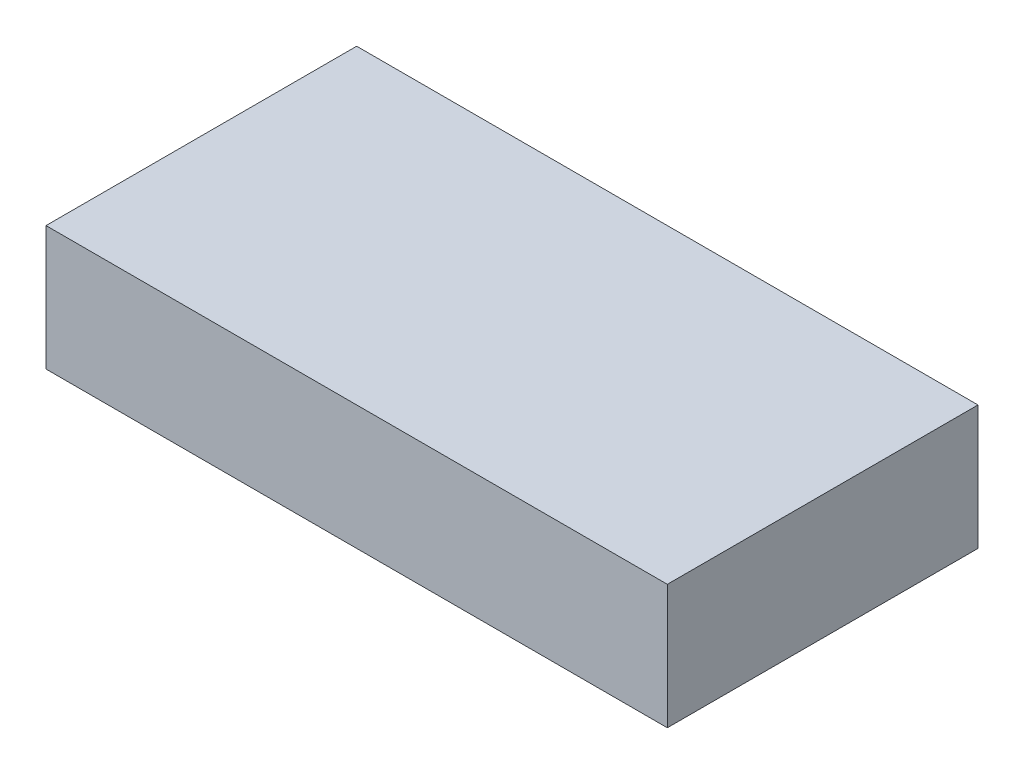
ISO-10303-21;
HEADER;
FILE_DESCRIPTION(('STEP AP214'),'2;1');
FILE_NAME('part.step','',(''),(''),'','','');
FILE_SCHEMA(('AUTOMOTIVE_DESIGN { 1 0 10303 214 1 1 1 1 }'));
ENDSEC;
DATA;
#1=APPLICATION_CONTEXT('core data for automotive mechanical design processes');
#2=APPLICATION_PROTOCOL_DEFINITION('international standard','automotive_design',2000,#1);
#3=PRODUCT_CONTEXT('',#1,'mechanical');
#4=PRODUCT('Part','Part','',(#3));
#5=PRODUCT_RELATED_PRODUCT_CATEGORY('part','',(#4));
#6=PRODUCT_DEFINITION_FORMATION('','',#4);
#7=PRODUCT_DEFINITION_CONTEXT('part definition',#1,'design');
#8=PRODUCT_DEFINITION('design','',#6,#7);
#9=PRODUCT_DEFINITION_SHAPE('','',#8);
#10=(LENGTH_UNIT() NAMED_UNIT(*) SI_UNIT(.MILLI.,.METRE.));
#11=(NAMED_UNIT(*) PLANE_ANGLE_UNIT() SI_UNIT($,.RADIAN.));
#12=(NAMED_UNIT(*) SI_UNIT($,.STERADIAN.) SOLID_ANGLE_UNIT());
#13=UNCERTAINTY_MEASURE_WITH_UNIT(LENGTH_MEASURE(1.E-05),#10,'distance_accuracy_value','');
#14=(GEOMETRIC_REPRESENTATION_CONTEXT(3) GLOBAL_UNCERTAINTY_ASSIGNED_CONTEXT((#13)) GLOBAL_UNIT_ASSIGNED_CONTEXT((#10,
#11,#12)) REPRESENTATION_CONTEXT('',''));
#15=CARTESIAN_POINT('',(0.,0.,0.));
#16=DIRECTION('',(0.,0.,1.));
#17=DIRECTION('',(1.,0.,0.));
#18=AXIS2_PLACEMENT_3D('',#15,#16,#17);
#19=CARTESIAN_POINT('',(0.,0.,0.));
#20=DIRECTION('',(0.,-1.,0.));
#21=DIRECTION('',(0.,0.,-1.));
#22=AXIS2_PLACEMENT_3D('',#19,#20,#21);
#23=PLANE('',#22);
#24=DIRECTION('',(0.,0.,1.));
#25=VECTOR('',#24,1.);
#26=CARTESIAN_POINT('',(0.,0.,0.));
#27=LINE('',#26,#25);
#28=CARTESIAN_POINT('',(0.,0.,-8.));
#29=VERTEX_POINT('',#28);
#30=CARTESIAN_POINT('',(0.,0.,0.));
#31=VERTEX_POINT('',#30);
#32=EDGE_CURVE('E134',#29,#31,#27,.T.);
#33=ORIENTED_EDGE('',*,*,#32,.F.);
#34=DIRECTION('',(-1.,0.,0.));
#35=VECTOR('',#34,1.);
#36=CARTESIAN_POINT('',(0.,0.,-8.));
#37=LINE('',#36,#35);
#38=CARTESIAN_POINT('',(16.,0.,-8.));
#39=VERTEX_POINT('',#38);
#40=EDGE_CURVE('E82',#39,#29,#37,.T.);
#41=ORIENTED_EDGE('',*,*,#40,.F.);
#42=DIRECTION('',(0.,0.,-1.));
#43=VECTOR('',#42,1.);
#44=CARTESIAN_POINT('',(16.,0.,0.));
#45=LINE('',#44,#43);
#46=CARTESIAN_POINT('',(16.,0.,0.));
#47=VERTEX_POINT('',#46);
#48=EDGE_CURVE('E162',#47,#39,#45,.T.);
#49=ORIENTED_EDGE('',*,*,#48,.F.);
#50=DIRECTION('',(1.,0.,0.));
#51=VECTOR('',#50,1.);
#52=CARTESIAN_POINT('',(0.,0.,0.));
#53=LINE('',#52,#51);
#54=EDGE_CURVE('E138',#31,#47,#53,.T.);
#55=ORIENTED_EDGE('',*,*,#54,.F.);
#56=EDGE_LOOP('',(#33,#41,#49,#55));
#57=FACE_BOUND('',#56,.T.);
#58=DIRECTION('',(-1.,0.,0.));
#59=VECTOR('',#58,1.);
#60=CARTESIAN_POINT('',(0.,0.,-6.4));
#61=LINE('',#60,#59);
#62=CARTESIAN_POINT('',(14.4,0.,-6.4));
#63=VERTEX_POINT('',#62);
#64=CARTESIAN_POINT('',(1.6,0.,-6.4));
#65=VERTEX_POINT('',#64);
#66=EDGE_CURVE('E129',#63,#65,#61,.T.);
#67=ORIENTED_EDGE('',*,*,#66,.T.);
#68=DIRECTION('',(0.,0.,1.));
#69=VECTOR('',#68,1.);
#70=CARTESIAN_POINT('',(1.6,0.,0.));
#71=LINE('',#70,#69);
#72=CARTESIAN_POINT('',(1.6,0.,-1.6));
#73=VERTEX_POINT('',#72);
#74=EDGE_CURVE('E148',#65,#73,#71,.T.);
#75=ORIENTED_EDGE('',*,*,#74,.T.);
#76=DIRECTION('',(1.,0.,0.));
#77=VECTOR('',#76,1.);
#78=CARTESIAN_POINT('',(0.,0.,-1.6));
#79=LINE('',#78,#77);
#80=CARTESIAN_POINT('',(14.4,0.,-1.6));
#81=VERTEX_POINT('',#80);
#82=EDGE_CURVE('E133',#73,#81,#79,.T.);
#83=ORIENTED_EDGE('',*,*,#82,.T.);
#84=DIRECTION('',(0.,0.,-1.));
#85=VECTOR('',#84,1.);
#86=CARTESIAN_POINT('',(14.4,0.,0.));
#87=LINE('',#86,#85);
#88=EDGE_CURVE('E52',#81,#63,#87,.T.);
#89=ORIENTED_EDGE('',*,*,#88,.T.);
#90=EDGE_LOOP('',(#67,#75,#83,#89));
#91=FACE_BOUND('',#90,.T.);
#92=ADVANCED_FACE('F37',(#57,#91),#23,.T.);
#93=CARTESIAN_POINT('',(0.,3.2,0.));
#94=DIRECTION('',(1.,0.,0.));
#95=DIRECTION('',(0.,0.,-1.));
#96=AXIS2_PLACEMENT_3D('',#93,#94,#95);
#97=PLANE('',#96);
#98=ORIENTED_EDGE('',*,*,#32,.T.);
#99=DIRECTION('',(0.,-1.,0.));
#100=VECTOR('',#99,1.);
#101=CARTESIAN_POINT('',(0.,3.2,0.));
#102=LINE('',#101,#100);
#103=CARTESIAN_POINT('',(0.,3.2,0.));
#104=VERTEX_POINT('',#103);
#105=EDGE_CURVE('E11',#104,#31,#102,.T.);
#106=ORIENTED_EDGE('',*,*,#105,.F.);
#107=DIRECTION('',(0.,0.,1.));
#108=VECTOR('',#107,1.);
#109=CARTESIAN_POINT('',(0.,3.2,0.));
#110=LINE('',#109,#108);
#111=CARTESIAN_POINT('',(0.,3.2,-8.));
#112=VERTEX_POINT('',#111);
#113=EDGE_CURVE('E154',#112,#104,#110,.T.);
#114=ORIENTED_EDGE('',*,*,#113,.F.);
#115=DIRECTION('',(0.,-1.,0.));
#116=VECTOR('',#115,1.);
#117=CARTESIAN_POINT('',(0.,3.2,-8.));
#118=LINE('',#117,#116);
#119=EDGE_CURVE('E159',#112,#29,#118,.T.);
#120=ORIENTED_EDGE('',*,*,#119,.T.);
#121=EDGE_LOOP('',(#98,#106,#114,#120));
#122=FACE_BOUND('',#121,.T.);
#123=ADVANCED_FACE('F39',(#122),#97,.F.);
#124=CARTESIAN_POINT('',(0.,3.2,0.));
#125=DIRECTION('',(0.,0.,-1.));
#126=DIRECTION('',(-1.,0.,0.));
#127=AXIS2_PLACEMENT_3D('',#124,#125,#126);
#128=PLANE('',#127);
#129=ORIENTED_EDGE('',*,*,#54,.T.);
#130=DIRECTION('',(0.,-1.,0.));
#131=VECTOR('',#130,1.);
#132=CARTESIAN_POINT('',(16.,3.2,0.));
#133=LINE('',#132,#131);
#134=CARTESIAN_POINT('',(16.,3.2,0.));
#135=VERTEX_POINT('',#134);
#136=EDGE_CURVE('E45',#135,#47,#133,.T.);
#137=ORIENTED_EDGE('',*,*,#136,.F.);
#138=DIRECTION('',(1.,0.,0.));
#139=VECTOR('',#138,1.);
#140=CARTESIAN_POINT('',(0.,3.2,0.));
#141=LINE('',#140,#139);
#142=EDGE_CURVE('E89',#104,#135,#141,.T.);
#143=ORIENTED_EDGE('',*,*,#142,.F.);
#144=ORIENTED_EDGE('',*,*,#105,.T.);
#145=EDGE_LOOP('',(#129,#137,#143,#144));
#146=FACE_BOUND('',#145,.T.);
#147=ADVANCED_FACE('F188',(#146),#128,.F.);
#148=CARTESIAN_POINT('',(16.,3.2,0.));
#149=DIRECTION('',(-1.,0.,0.));
#150=DIRECTION('',(0.,0.,1.));
#151=AXIS2_PLACEMENT_3D('',#148,#149,#150);
#152=PLANE('',#151);
#153=ORIENTED_EDGE('',*,*,#48,.T.);
#154=DIRECTION('',(0.,-1.,0.));
#155=VECTOR('',#154,1.);
#156=CARTESIAN_POINT('',(16.,3.2,-8.));
#157=LINE('',#156,#155);
#158=CARTESIAN_POINT('',(16.,3.2,-8.));
#159=VERTEX_POINT('',#158);
#160=EDGE_CURVE('E166',#159,#39,#157,.T.);
#161=ORIENTED_EDGE('',*,*,#160,.F.);
#162=DIRECTION('',(0.,0.,-1.));
#163=VECTOR('',#162,1.);
#164=CARTESIAN_POINT('',(16.,3.2,0.));
#165=LINE('',#164,#163);
#166=EDGE_CURVE('E157',#135,#159,#165,.T.);
#167=ORIENTED_EDGE('',*,*,#166,.F.);
#168=ORIENTED_EDGE('',*,*,#136,.T.);
#169=EDGE_LOOP('',(#153,#161,#167,#168));
#170=FACE_BOUND('',#169,.T.);
#171=ADVANCED_FACE('F171',(#170),#152,.F.);
#172=CARTESIAN_POINT('',(0.,3.2,-8.));
#173=DIRECTION('',(0.,0.,1.));
#174=DIRECTION('',(1.,0.,0.));
#175=AXIS2_PLACEMENT_3D('',#172,#173,#174);
#176=PLANE('',#175);
#177=ORIENTED_EDGE('',*,*,#40,.T.);
#178=ORIENTED_EDGE('',*,*,#119,.F.);
#179=DIRECTION('',(-1.,0.,0.));
#180=VECTOR('',#179,1.);
#181=CARTESIAN_POINT('',(0.,3.2,-8.));
#182=LINE('',#181,#180);
#183=EDGE_CURVE('E61',#159,#112,#182,.T.);
#184=ORIENTED_EDGE('',*,*,#183,.F.);
#185=ORIENTED_EDGE('',*,*,#160,.T.);
#186=EDGE_LOOP('',(#177,#178,#184,#185));
#187=FACE_BOUND('',#186,.T.);
#188=ADVANCED_FACE('F179',(#187),#176,.F.);
#189=CARTESIAN_POINT('',(0.,3.2,0.));
#190=DIRECTION('',(0.,-1.,0.));
#191=DIRECTION('',(0.,0.,-1.));
#192=AXIS2_PLACEMENT_3D('',#189,#190,#191);
#193=PLANE('',#192);
#194=ORIENTED_EDGE('',*,*,#113,.T.);
#195=ORIENTED_EDGE('',*,*,#142,.T.);
#196=ORIENTED_EDGE('',*,*,#166,.T.);
#197=ORIENTED_EDGE('',*,*,#183,.T.);
#198=EDGE_LOOP('',(#194,#195,#196,#197));
#199=FACE_BOUND('',#198,.T.);
#200=ADVANCED_FACE('F181',(#199),#193,.F.);
#201=CARTESIAN_POINT('',(1.6,3.2,0.));
#202=DIRECTION('',(1.,0.,0.));
#203=DIRECTION('',(0.,0.,-1.));
#204=AXIS2_PLACEMENT_3D('',#201,#202,#203);
#205=PLANE('',#204);
#206=ORIENTED_EDGE('',*,*,#74,.F.);
#207=DIRECTION('',(0.,-1.,0.));
#208=VECTOR('',#207,1.);
#209=CARTESIAN_POINT('',(1.6,3.2,-6.4));
#210=LINE('',#209,#208);
#211=CARTESIAN_POINT('',(1.6,1.6,-6.4));
#212=VERTEX_POINT('',#211);
#213=EDGE_CURVE('E128',#212,#65,#210,.T.);
#214=ORIENTED_EDGE('',*,*,#213,.F.);
#215=DIRECTION('',(0.,0.,1.));
#216=VECTOR('',#215,1.);
#217=CARTESIAN_POINT('',(1.6,1.6,0.));
#218=LINE('',#217,#216);
#219=CARTESIAN_POINT('',(1.6,1.6,-1.6));
#220=VERTEX_POINT('',#219);
#221=EDGE_CURVE('E116',#212,#220,#218,.T.);
#222=ORIENTED_EDGE('',*,*,#221,.T.);
#223=DIRECTION('',(0.,-1.,0.));
#224=VECTOR('',#223,1.);
#225=CARTESIAN_POINT('',(1.6,3.2,-1.6));
#226=LINE('',#225,#224);
#227=EDGE_CURVE('E126',#220,#73,#226,.T.);
#228=ORIENTED_EDGE('',*,*,#227,.T.);
#229=EDGE_LOOP('',(#206,#214,#222,#228));
#230=FACE_BOUND('',#229,.T.);
#231=ADVANCED_FACE('F125',(#230),#205,.T.);
#232=CARTESIAN_POINT('',(0.,3.2,-1.6));
#233=DIRECTION('',(0.,0.,-1.));
#234=DIRECTION('',(-1.,0.,0.));
#235=AXIS2_PLACEMENT_3D('',#232,#233,#234);
#236=PLANE('',#235);
#237=ORIENTED_EDGE('',*,*,#82,.F.);
#238=ORIENTED_EDGE('',*,*,#227,.F.);
#239=DIRECTION('',(1.,0.,0.));
#240=VECTOR('',#239,1.);
#241=CARTESIAN_POINT('',(0.,1.6,-1.6));
#242=LINE('',#241,#240);
#243=CARTESIAN_POINT('',(14.4,1.6,-1.6));
#244=VERTEX_POINT('',#243);
#245=EDGE_CURVE('E112',#220,#244,#242,.T.);
#246=ORIENTED_EDGE('',*,*,#245,.T.);
#247=DIRECTION('',(0.,-1.,0.));
#248=VECTOR('',#247,1.);
#249=CARTESIAN_POINT('',(14.4,3.2,-1.6));
#250=LINE('',#249,#248);
#251=EDGE_CURVE('E135',#244,#81,#250,.T.);
#252=ORIENTED_EDGE('',*,*,#251,.T.);
#253=EDGE_LOOP('',(#237,#238,#246,#252));
#254=FACE_BOUND('',#253,.T.);
#255=ADVANCED_FACE('F131',(#254),#236,.T.);
#256=CARTESIAN_POINT('',(14.4,3.2,0.));
#257=DIRECTION('',(-1.,0.,0.));
#258=DIRECTION('',(0.,0.,1.));
#259=AXIS2_PLACEMENT_3D('',#256,#257,#258);
#260=PLANE('',#259);
#261=ORIENTED_EDGE('',*,*,#88,.F.);
#262=ORIENTED_EDGE('',*,*,#251,.F.);
#263=DIRECTION('',(0.,0.,-1.));
#264=VECTOR('',#263,1.);
#265=CARTESIAN_POINT('',(14.4,1.6,0.));
#266=LINE('',#265,#264);
#267=CARTESIAN_POINT('',(14.4,1.6,-6.4));
#268=VERTEX_POINT('',#267);
#269=EDGE_CURVE('E117',#244,#268,#266,.T.);
#270=ORIENTED_EDGE('',*,*,#269,.T.);
#271=DIRECTION('',(0.,-1.,0.));
#272=VECTOR('',#271,1.);
#273=CARTESIAN_POINT('',(14.4,3.2,-6.4));
#274=LINE('',#273,#272);
#275=EDGE_CURVE('E140',#268,#63,#274,.T.);
#276=ORIENTED_EDGE('',*,*,#275,.T.);
#277=EDGE_LOOP('',(#261,#262,#270,#276));
#278=FACE_BOUND('',#277,.T.);
#279=ADVANCED_FACE('F201',(#278),#260,.T.);
#280=CARTESIAN_POINT('',(0.,3.2,-6.4));
#281=DIRECTION('',(0.,0.,1.));
#282=DIRECTION('',(1.,0.,0.));
#283=AXIS2_PLACEMENT_3D('',#280,#281,#282);
#284=PLANE('',#283);
#285=ORIENTED_EDGE('',*,*,#66,.F.);
#286=ORIENTED_EDGE('',*,*,#275,.F.);
#287=DIRECTION('',(-1.,0.,0.));
#288=VECTOR('',#287,1.);
#289=CARTESIAN_POINT('',(0.,1.6,-6.4));
#290=LINE('',#289,#288);
#291=EDGE_CURVE('E143',#268,#212,#290,.T.);
#292=ORIENTED_EDGE('',*,*,#291,.T.);
#293=ORIENTED_EDGE('',*,*,#213,.T.);
#294=EDGE_LOOP('',(#285,#286,#292,#293));
#295=FACE_BOUND('',#294,.T.);
#296=ADVANCED_FACE('F198',(#295),#284,.T.);
#297=CARTESIAN_POINT('',(0.,1.6,0.));
#298=DIRECTION('',(0.,-1.,0.));
#299=DIRECTION('',(0.,0.,-1.));
#300=AXIS2_PLACEMENT_3D('',#297,#298,#299);
#301=PLANE('',#300);
#302=ORIENTED_EDGE('',*,*,#221,.F.);
#303=ORIENTED_EDGE('',*,*,#291,.F.);
#304=ORIENTED_EDGE('',*,*,#269,.F.);
#305=ORIENTED_EDGE('',*,*,#245,.F.);
#306=EDGE_LOOP('',(#302,#303,#304,#305));
#307=FACE_BOUND('',#306,.T.);
#308=ADVANCED_FACE('F114',(#307),#301,.T.);
#309=CLOSED_SHELL('',(#92,#123,#147,#171,#188,#200,#231,#255,#279,#296,#308));
#310=MANIFOLD_SOLID_BREP('B2',#309);
#311=ADVANCED_BREP_SHAPE_REPRESENTATION('',(#18,#310),#14);
#312=SHAPE_DEFINITION_REPRESENTATION(#9,#311);
ENDSEC;
END-ISO-10303-21;
